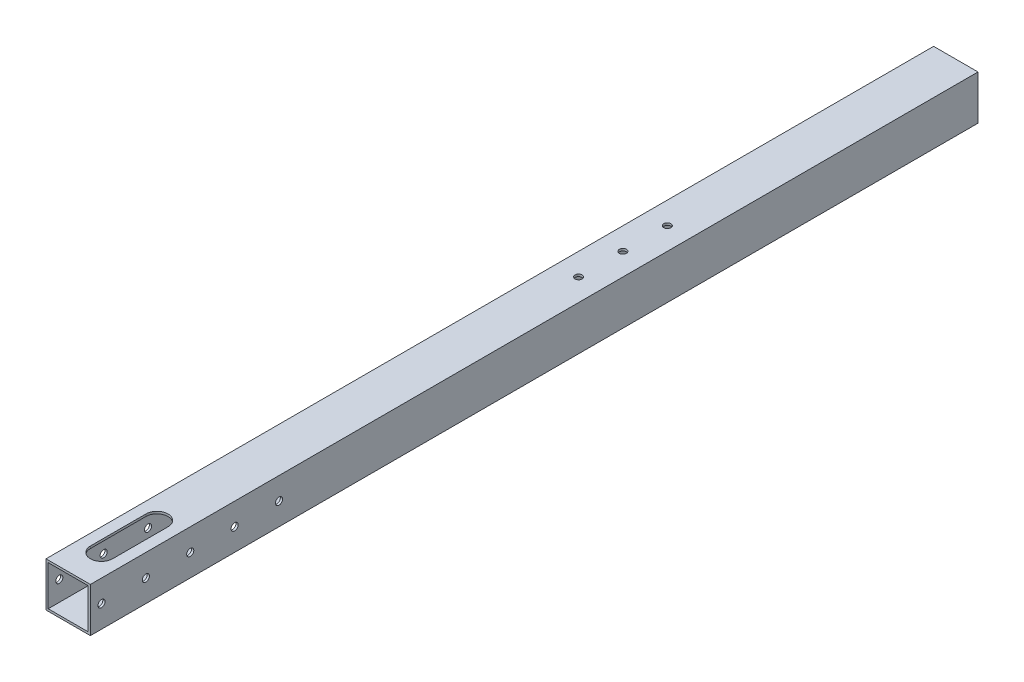
ISO-10303-21;
HEADER;
FILE_DESCRIPTION(('STEP AP214'),'2;1');
FILE_NAME('part.step','',(''),(''),'','','');
FILE_SCHEMA(('AUTOMOTIVE_DESIGN { 1 0 10303 214 1 1 1 1 }'));
ENDSEC;
DATA;
#1=APPLICATION_CONTEXT('core data for automotive mechanical design processes');
#2=APPLICATION_PROTOCOL_DEFINITION('international standard','automotive_design',2000,#1);
#3=PRODUCT_CONTEXT('',#1,'mechanical');
#4=PRODUCT('Part','Part','',(#3));
#5=PRODUCT_RELATED_PRODUCT_CATEGORY('part','',(#4));
#6=PRODUCT_DEFINITION_FORMATION('','',#4);
#7=PRODUCT_DEFINITION_CONTEXT('part definition',#1,'design');
#8=PRODUCT_DEFINITION('design','',#6,#7);
#9=PRODUCT_DEFINITION_SHAPE('','',#8);
#10=(LENGTH_UNIT() NAMED_UNIT(*) SI_UNIT(.MILLI.,.METRE.));
#11=(NAMED_UNIT(*) PLANE_ANGLE_UNIT() SI_UNIT($,.RADIAN.));
#12=(NAMED_UNIT(*) SI_UNIT($,.STERADIAN.) SOLID_ANGLE_UNIT());
#13=UNCERTAINTY_MEASURE_WITH_UNIT(LENGTH_MEASURE(1.E-05),#10,'distance_accuracy_value','');
#14=(GEOMETRIC_REPRESENTATION_CONTEXT(3) GLOBAL_UNCERTAINTY_ASSIGNED_CONTEXT((#13)) GLOBAL_UNIT_ASSIGNED_CONTEXT((#10,
#11,#12)) REPRESENTATION_CONTEXT('',''));
#15=CARTESIAN_POINT('',(0.,0.,0.));
#16=DIRECTION('',(0.,0.,1.));
#17=DIRECTION('',(1.,0.,0.));
#18=AXIS2_PLACEMENT_3D('',#15,#16,#17);
#19=CARTESIAN_POINT('',(0.,0.,400.));
#20=DIRECTION('',(0.,0.,1.));
#21=DIRECTION('',(1.,0.,0.));
#22=AXIS2_PLACEMENT_3D('',#19,#20,#21);
#23=PLANE('',#22);
#24=DIRECTION('',(0.,-1.,0.));
#25=VECTOR('',#24,1.);
#26=CARTESIAN_POINT('',(0.,0.,400.));
#27=LINE('',#26,#25);
#28=CARTESIAN_POINT('',(0.,0.,400.));
#29=VERTEX_POINT('',#28);
#30=CARTESIAN_POINT('',(0.,-20.,400.));
#31=VERTEX_POINT('',#30);
#32=EDGE_CURVE('E331',#29,#31,#27,.T.);
#33=ORIENTED_EDGE('',*,*,#32,.T.);
#34=DIRECTION('',(1.,0.,0.));
#35=VECTOR('',#34,1.);
#36=CARTESIAN_POINT('',(0.,-20.,400.));
#37=LINE('',#36,#35);
#38=CARTESIAN_POINT('',(20.,-20.,400.));
#39=VERTEX_POINT('',#38);
#40=EDGE_CURVE('E334',#31,#39,#37,.T.);
#41=ORIENTED_EDGE('',*,*,#40,.T.);
#42=DIRECTION('',(0.,1.,0.));
#43=VECTOR('',#42,1.);
#44=CARTESIAN_POINT('',(20.,0.,400.));
#45=LINE('',#44,#43);
#46=CARTESIAN_POINT('',(20.,0.,400.));
#47=VERTEX_POINT('',#46);
#48=EDGE_CURVE('E337',#39,#47,#45,.T.);
#49=ORIENTED_EDGE('',*,*,#48,.T.);
#50=DIRECTION('',(-1.,0.,0.));
#51=VECTOR('',#50,1.);
#52=CARTESIAN_POINT('',(0.,0.,400.));
#53=LINE('',#52,#51);
#54=EDGE_CURVE('E339',#47,#29,#53,.T.);
#55=ORIENTED_EDGE('',*,*,#54,.T.);
#56=EDGE_LOOP('',(#33,#41,#49,#55));
#57=FACE_BOUND('',#56,.T.);
#58=DIRECTION('',(1.,0.,0.));
#59=VECTOR('',#58,1.);
#60=CARTESIAN_POINT('',(0.,-19.,400.));
#61=LINE('',#60,#59);
#62=CARTESIAN_POINT('',(1.,-19.,400.));
#63=VERTEX_POINT('',#62);
#64=CARTESIAN_POINT('',(19.,-19.,400.));
#65=VERTEX_POINT('',#64);
#66=EDGE_CURVE('E302',#63,#65,#61,.T.);
#67=ORIENTED_EDGE('',*,*,#66,.F.);
#68=DIRECTION('',(0.,-1.,0.));
#69=VECTOR('',#68,1.);
#70=CARTESIAN_POINT('',(1.,0.,400.));
#71=LINE('',#70,#69);
#72=CARTESIAN_POINT('',(1.,-1.,400.));
#73=VERTEX_POINT('',#72);
#74=EDGE_CURVE('E300',#73,#63,#71,.T.);
#75=ORIENTED_EDGE('',*,*,#74,.F.);
#76=DIRECTION('',(-1.,0.,0.));
#77=VECTOR('',#76,1.);
#78=CARTESIAN_POINT('',(0.,-1.,400.));
#79=LINE('',#78,#77);
#80=CARTESIAN_POINT('',(19.,-1.,400.));
#81=VERTEX_POINT('',#80);
#82=EDGE_CURVE('E308',#81,#73,#79,.T.);
#83=ORIENTED_EDGE('',*,*,#82,.F.);
#84=DIRECTION('',(0.,1.,0.));
#85=VECTOR('',#84,1.);
#86=CARTESIAN_POINT('',(19.,0.,400.));
#87=LINE('',#86,#85);
#88=EDGE_CURVE('E305',#65,#81,#87,.T.);
#89=ORIENTED_EDGE('',*,*,#88,.F.);
#90=EDGE_LOOP('',(#67,#75,#83,#89));
#91=FACE_BOUND('',#90,.T.);
#92=ADVANCED_FACE('F65',(#57,#91),#23,.T.);
#93=CARTESIAN_POINT('',(0.,0.,0.));
#94=DIRECTION('',(0.,0.,1.));
#95=DIRECTION('',(1.,0.,0.));
#96=AXIS2_PLACEMENT_3D('',#93,#94,#95);
#97=PLANE('',#96);
#98=DIRECTION('',(0.,-1.,0.));
#99=VECTOR('',#98,1.);
#100=CARTESIAN_POINT('',(0.,0.,0.));
#101=LINE('',#100,#99);
#102=CARTESIAN_POINT('',(0.,0.,0.));
#103=VERTEX_POINT('',#102);
#104=CARTESIAN_POINT('',(0.,-20.,0.));
#105=VERTEX_POINT('',#104);
#106=EDGE_CURVE('E330',#103,#105,#101,.T.);
#107=ORIENTED_EDGE('',*,*,#106,.F.);
#108=DIRECTION('',(-1.,0.,0.));
#109=VECTOR('',#108,1.);
#110=CARTESIAN_POINT('',(0.,0.,0.));
#111=LINE('',#110,#109);
#112=CARTESIAN_POINT('',(20.,0.,0.));
#113=VERTEX_POINT('',#112);
#114=EDGE_CURVE('E335',#113,#103,#111,.T.);
#115=ORIENTED_EDGE('',*,*,#114,.F.);
#116=DIRECTION('',(0.,1.,0.));
#117=VECTOR('',#116,1.);
#118=CARTESIAN_POINT('',(20.,0.,0.));
#119=LINE('',#118,#117);
#120=CARTESIAN_POINT('',(20.,-20.,0.));
#121=VERTEX_POINT('',#120);
#122=EDGE_CURVE('E346',#121,#113,#119,.T.);
#123=ORIENTED_EDGE('',*,*,#122,.F.);
#124=DIRECTION('',(1.,0.,0.));
#125=VECTOR('',#124,1.);
#126=CARTESIAN_POINT('',(0.,-20.,0.));
#127=LINE('',#126,#125);
#128=EDGE_CURVE('E344',#105,#121,#127,.T.);
#129=ORIENTED_EDGE('',*,*,#128,.F.);
#130=EDGE_LOOP('',(#107,#115,#123,#129));
#131=FACE_BOUND('',#130,.T.);
#132=DIRECTION('',(0.,-1.,0.));
#133=VECTOR('',#132,1.);
#134=CARTESIAN_POINT('',(1.,0.,0.));
#135=LINE('',#134,#133);
#136=CARTESIAN_POINT('',(1.,-1.,0.));
#137=VERTEX_POINT('',#136);
#138=CARTESIAN_POINT('',(1.,-19.,0.));
#139=VERTEX_POINT('',#138);
#140=EDGE_CURVE('E299',#137,#139,#135,.T.);
#141=ORIENTED_EDGE('',*,*,#140,.T.);
#142=DIRECTION('',(1.,0.,0.));
#143=VECTOR('',#142,1.);
#144=CARTESIAN_POINT('',(0.,-19.,0.));
#145=LINE('',#144,#143);
#146=CARTESIAN_POINT('',(19.,-19.,0.));
#147=VERTEX_POINT('',#146);
#148=EDGE_CURVE('E313',#139,#147,#145,.T.);
#149=ORIENTED_EDGE('',*,*,#148,.T.);
#150=DIRECTION('',(0.,1.,0.));
#151=VECTOR('',#150,1.);
#152=CARTESIAN_POINT('',(19.,0.,0.));
#153=LINE('',#152,#151);
#154=CARTESIAN_POINT('',(19.,-1.,0.));
#155=VERTEX_POINT('',#154);
#156=EDGE_CURVE('E316',#147,#155,#153,.T.);
#157=ORIENTED_EDGE('',*,*,#156,.T.);
#158=DIRECTION('',(-1.,0.,0.));
#159=VECTOR('',#158,1.);
#160=CARTESIAN_POINT('',(0.,-1.,0.));
#161=LINE('',#160,#159);
#162=EDGE_CURVE('E303',#155,#137,#161,.T.);
#163=ORIENTED_EDGE('',*,*,#162,.T.);
#164=EDGE_LOOP('',(#141,#149,#157,#163));
#165=FACE_BOUND('',#164,.T.);
#166=ADVANCED_FACE('F407',(#131,#165),#97,.F.);
#167=CARTESIAN_POINT('',(0.,0.,400.));
#168=DIRECTION('',(1.,0.,0.));
#169=DIRECTION('',(0.,1.,0.));
#170=AXIS2_PLACEMENT_3D('',#167,#168,#169);
#171=PLANE('',#170);
#172=CARTESIAN_POINT('',(0.,-9.99999999999993,395.));
#173=DIRECTION('',(1.,0.,0.));
#174=DIRECTION('',(0.,1.,0.));
#175=AXIS2_PLACEMENT_3D('',#172,#173,#174);
#176=CIRCLE('',#175,1.59999999999996);
#177=CARTESIAN_POINT('',(0.,-8.39999999999996,395.));
#178=VERTEX_POINT('',#177);
#179=EDGE_CURVE('E250',#178,#178,#176,.T.);
#180=ORIENTED_EDGE('',*,*,#179,.T.);
#181=EDGE_LOOP('',(#180));
#182=FACE_BOUND('',#181,.T.);
#183=CARTESIAN_POINT('',(0.,-9.99999999999993,375.));
#184=DIRECTION('',(1.,0.,0.));
#185=DIRECTION('',(0.,1.,0.));
#186=AXIS2_PLACEMENT_3D('',#183,#184,#185);
#187=CIRCLE('',#186,1.59999999999996);
#188=CARTESIAN_POINT('',(0.,-8.39999999999996,375.));
#189=VERTEX_POINT('',#188);
#190=EDGE_CURVE('E260',#189,#189,#187,.T.);
#191=ORIENTED_EDGE('',*,*,#190,.T.);
#192=EDGE_LOOP('',(#191));
#193=FACE_BOUND('',#192,.T.);
#194=CARTESIAN_POINT('',(0.,-9.99999999999993,355.));
#195=DIRECTION('',(1.,0.,0.));
#196=DIRECTION('',(0.,1.,0.));
#197=AXIS2_PLACEMENT_3D('',#194,#195,#196);
#198=CIRCLE('',#197,1.59999999999996);
#199=CARTESIAN_POINT('',(0.,-8.39999999999996,355.));
#200=VERTEX_POINT('',#199);
#201=EDGE_CURVE('E266',#200,#200,#198,.T.);
#202=ORIENTED_EDGE('',*,*,#201,.T.);
#203=EDGE_LOOP('',(#202));
#204=FACE_BOUND('',#203,.T.);
#205=CARTESIAN_POINT('',(0.,-9.99999999999993,335.));
#206=DIRECTION('',(1.,0.,0.));
#207=DIRECTION('',(0.,1.,0.));
#208=AXIS2_PLACEMENT_3D('',#205,#206,#207);
#209=CIRCLE('',#208,1.59999999999996);
#210=CARTESIAN_POINT('',(0.,-8.39999999999996,335.));
#211=VERTEX_POINT('',#210);
#212=EDGE_CURVE('E272',#211,#211,#209,.T.);
#213=ORIENTED_EDGE('',*,*,#212,.T.);
#214=EDGE_LOOP('',(#213));
#215=FACE_BOUND('',#214,.T.);
#216=CARTESIAN_POINT('',(0.,-9.99999999999993,315.));
#217=DIRECTION('',(1.,0.,0.));
#218=DIRECTION('',(0.,1.,0.));
#219=AXIS2_PLACEMENT_3D('',#216,#217,#218);
#220=CIRCLE('',#219,1.59999999999996);
#221=CARTESIAN_POINT('',(0.,-8.39999999999996,315.));
#222=VERTEX_POINT('',#221);
#223=EDGE_CURVE('E249',#222,#222,#220,.T.);
#224=ORIENTED_EDGE('',*,*,#223,.T.);
#225=EDGE_LOOP('',(#224));
#226=FACE_BOUND('',#225,.T.);
#227=ORIENTED_EDGE('',*,*,#106,.T.);
#228=DIRECTION('',(0.,0.,-1.));
#229=VECTOR('',#228,1.);
#230=CARTESIAN_POINT('',(0.,-20.,400.));
#231=LINE('',#230,#229);
#232=EDGE_CURVE('E12',#31,#105,#231,.T.);
#233=ORIENTED_EDGE('',*,*,#232,.F.);
#234=ORIENTED_EDGE('',*,*,#32,.F.);
#235=DIRECTION('',(0.,0.,-1.));
#236=VECTOR('',#235,1.);
#237=CARTESIAN_POINT('',(0.,0.,400.));
#238=LINE('',#237,#236);
#239=EDGE_CURVE('E341',#29,#103,#238,.T.);
#240=ORIENTED_EDGE('',*,*,#239,.T.);
#241=EDGE_LOOP('',(#227,#233,#234,#240));
#242=FACE_BOUND('',#241,.T.);
#243=ADVANCED_FACE('F67',(#182,#193,#204,#215,#226,#242),#171,.F.);
#244=CARTESIAN_POINT('',(0.,-20.,400.));
#245=DIRECTION('',(0.,1.,0.));
#246=DIRECTION('',(0.,0.,1.));
#247=AXIS2_PLACEMENT_3D('',#244,#245,#246);
#248=PLANE('',#247);
#249=CARTESIAN_POINT('',(10.,-20.,130.));
#250=DIRECTION('',(0.,1.,0.));
#251=DIRECTION('',(0.,0.,1.));
#252=AXIS2_PLACEMENT_3D('',#249,#250,#251);
#253=CIRCLE('',#252,1.59999999999999);
#254=CARTESIAN_POINT('',(10.,-20.,131.6));
#255=VERTEX_POINT('',#254);
#256=EDGE_CURVE('E369',#255,#255,#253,.T.);
#257=ORIENTED_EDGE('',*,*,#256,.T.);
#258=EDGE_LOOP('',(#257));
#259=FACE_BOUND('',#258,.T.);
#260=CARTESIAN_POINT('',(10.,-20.,150.));
#261=DIRECTION('',(0.,1.,0.));
#262=DIRECTION('',(0.,0.,1.));
#263=AXIS2_PLACEMENT_3D('',#260,#261,#262);
#264=CIRCLE('',#263,1.59999999999999);
#265=CARTESIAN_POINT('',(10.,-20.,151.6));
#266=VERTEX_POINT('',#265);
#267=EDGE_CURVE('E458',#266,#266,#264,.T.);
#268=ORIENTED_EDGE('',*,*,#267,.T.);
#269=EDGE_LOOP('',(#268));
#270=FACE_BOUND('',#269,.T.);
#271=CARTESIAN_POINT('',(10.,-20.,170.));
#272=DIRECTION('',(0.,1.,0.));
#273=DIRECTION('',(0.,0.,1.));
#274=AXIS2_PLACEMENT_3D('',#271,#272,#273);
#275=CIRCLE('',#274,1.59999999999999);
#276=CARTESIAN_POINT('',(10.,-20.,171.6));
#277=VERTEX_POINT('',#276);
#278=EDGE_CURVE('E382',#277,#277,#275,.T.);
#279=ORIENTED_EDGE('',*,*,#278,.T.);
#280=EDGE_LOOP('',(#279));
#281=FACE_BOUND('',#280,.T.);
#282=DIRECTION('',(0.,0.,-1.));
#283=VECTOR('',#282,1.);
#284=CARTESIAN_POINT('',(5.,-20.,335.));
#285=LINE('',#284,#283);
#286=CARTESIAN_POINT('',(5.,-20.,335.));
#287=VERTEX_POINT('',#286);
#288=CARTESIAN_POINT('',(5.00000000000001,-20.,315.));
#289=VERTEX_POINT('',#288);
#290=EDGE_CURVE('E203',#287,#289,#285,.T.);
#291=ORIENTED_EDGE('',*,*,#290,.F.);
#292=CARTESIAN_POINT('',(10.,-20.,335.));
#293=DIRECTION('',(0.,-1.,0.));
#294=DIRECTION('',(0.,0.,-1.));
#295=AXIS2_PLACEMENT_3D('',#292,#293,#294);
#296=CIRCLE('',#295,5.);
#297=CARTESIAN_POINT('',(15.,-20.,335.));
#298=VERTEX_POINT('',#297);
#299=EDGE_CURVE('E82',#298,#287,#296,.T.);
#300=ORIENTED_EDGE('',*,*,#299,.F.);
#301=DIRECTION('',(0.,0.,1.));
#302=VECTOR('',#301,1.);
#303=CARTESIAN_POINT('',(15.,-20.,335.));
#304=LINE('',#303,#302);
#305=CARTESIAN_POINT('',(15.,-20.,315.));
#306=VERTEX_POINT('',#305);
#307=EDGE_CURVE('E190',#306,#298,#304,.T.);
#308=ORIENTED_EDGE('',*,*,#307,.F.);
#309=CARTESIAN_POINT('',(10.,-20.,315.));
#310=DIRECTION('',(0.,-1.,0.));
#311=DIRECTION('',(0.,0.,-1.));
#312=AXIS2_PLACEMENT_3D('',#309,#310,#311);
#313=CIRCLE('',#312,5.);
#314=EDGE_CURVE('E198',#289,#306,#313,.T.);
#315=ORIENTED_EDGE('',*,*,#314,.F.);
#316=EDGE_LOOP('',(#291,#300,#308,#315));
#317=FACE_BOUND('',#316,.T.);
#318=ORIENTED_EDGE('',*,*,#128,.T.);
#319=DIRECTION('',(0.,0.,-1.));
#320=VECTOR('',#319,1.);
#321=CARTESIAN_POINT('',(20.,-20.,400.));
#322=LINE('',#321,#320);
#323=EDGE_CURVE('E74',#39,#121,#322,.T.);
#324=ORIENTED_EDGE('',*,*,#323,.F.);
#325=ORIENTED_EDGE('',*,*,#40,.F.);
#326=ORIENTED_EDGE('',*,*,#232,.T.);
#327=EDGE_LOOP('',(#318,#324,#325,#326));
#328=FACE_BOUND('',#327,.T.);
#329=ADVANCED_FACE('F201',(#259,#270,#281,#317,#328),#248,.F.);
#330=CARTESIAN_POINT('',(20.,0.,400.));
#331=DIRECTION('',(-1.,0.,0.));
#332=DIRECTION('',(0.,-1.,0.));
#333=AXIS2_PLACEMENT_3D('',#330,#331,#332);
#334=PLANE('',#333);
#335=CARTESIAN_POINT('',(20.,-9.99999999999993,395.));
#336=DIRECTION('',(1.,0.,0.));
#337=DIRECTION('',(0.,1.,0.));
#338=AXIS2_PLACEMENT_3D('',#335,#336,#337);
#339=CIRCLE('',#338,1.59999999999996);
#340=CARTESIAN_POINT('',(20.,-8.39999999999996,395.));
#341=VERTEX_POINT('',#340);
#342=EDGE_CURVE('E254',#341,#341,#339,.T.);
#343=ORIENTED_EDGE('',*,*,#342,.F.);
#344=EDGE_LOOP('',(#343));
#345=FACE_BOUND('',#344,.T.);
#346=CARTESIAN_POINT('',(20.,-9.99999999999993,375.));
#347=DIRECTION('',(1.,0.,0.));
#348=DIRECTION('',(0.,1.,0.));
#349=AXIS2_PLACEMENT_3D('',#346,#347,#348);
#350=CIRCLE('',#349,1.59999999999996);
#351=CARTESIAN_POINT('',(20.,-8.39999999999996,375.));
#352=VERTEX_POINT('',#351);
#353=EDGE_CURVE('E257',#352,#352,#350,.T.);
#354=ORIENTED_EDGE('',*,*,#353,.F.);
#355=EDGE_LOOP('',(#354));
#356=FACE_BOUND('',#355,.T.);
#357=CARTESIAN_POINT('',(20.,-9.99999999999993,355.));
#358=DIRECTION('',(1.,0.,0.));
#359=DIRECTION('',(0.,1.,0.));
#360=AXIS2_PLACEMENT_3D('',#357,#358,#359);
#361=CIRCLE('',#360,1.59999999999996);
#362=CARTESIAN_POINT('',(20.,-8.39999999999996,355.));
#363=VERTEX_POINT('',#362);
#364=EDGE_CURVE('E263',#363,#363,#361,.T.);
#365=ORIENTED_EDGE('',*,*,#364,.F.);
#366=EDGE_LOOP('',(#365));
#367=FACE_BOUND('',#366,.T.);
#368=CARTESIAN_POINT('',(20.,-9.99999999999993,335.));
#369=DIRECTION('',(1.,0.,0.));
#370=DIRECTION('',(0.,1.,0.));
#371=AXIS2_PLACEMENT_3D('',#368,#369,#370);
#372=CIRCLE('',#371,1.59999999999996);
#373=CARTESIAN_POINT('',(20.,-8.39999999999996,335.));
#374=VERTEX_POINT('',#373);
#375=EDGE_CURVE('E269',#374,#374,#372,.T.);
#376=ORIENTED_EDGE('',*,*,#375,.F.);
#377=EDGE_LOOP('',(#376));
#378=FACE_BOUND('',#377,.T.);
#379=CARTESIAN_POINT('',(20.,-9.99999999999993,315.));
#380=DIRECTION('',(1.,0.,0.));
#381=DIRECTION('',(0.,1.,0.));
#382=AXIS2_PLACEMENT_3D('',#379,#380,#381);
#383=CIRCLE('',#382,1.59999999999996);
#384=CARTESIAN_POINT('',(20.,-8.39999999999996,315.));
#385=VERTEX_POINT('',#384);
#386=EDGE_CURVE('E275',#385,#385,#383,.T.);
#387=ORIENTED_EDGE('',*,*,#386,.F.);
#388=EDGE_LOOP('',(#387));
#389=FACE_BOUND('',#388,.T.);
#390=ORIENTED_EDGE('',*,*,#122,.T.);
#391=DIRECTION('',(0.,0.,-1.));
#392=VECTOR('',#391,1.);
#393=CARTESIAN_POINT('',(20.,0.,400.));
#394=LINE('',#393,#392);
#395=EDGE_CURVE('E351',#47,#113,#394,.T.);
#396=ORIENTED_EDGE('',*,*,#395,.F.);
#397=ORIENTED_EDGE('',*,*,#48,.F.);
#398=ORIENTED_EDGE('',*,*,#323,.T.);
#399=EDGE_LOOP('',(#390,#396,#397,#398));
#400=FACE_BOUND('',#399,.T.);
#401=ADVANCED_FACE('F441',(#345,#356,#367,#378,#389,#400),#334,.F.);
#402=CARTESIAN_POINT('',(0.,0.,400.));
#403=DIRECTION('',(0.,-1.,0.));
#404=DIRECTION('',(0.,0.,-1.));
#405=AXIS2_PLACEMENT_3D('',#402,#403,#404);
#406=PLANE('',#405);
#407=CARTESIAN_POINT('',(10.,0.,130.));
#408=DIRECTION('',(0.,1.,0.));
#409=DIRECTION('',(0.,0.,1.));
#410=AXIS2_PLACEMENT_3D('',#407,#408,#409);
#411=CIRCLE('',#410,1.59999999999999);
#412=CARTESIAN_POINT('',(10.,0.,131.6));
#413=VERTEX_POINT('',#412);
#414=EDGE_CURVE('E471',#413,#413,#411,.T.);
#415=ORIENTED_EDGE('',*,*,#414,.F.);
#416=EDGE_LOOP('',(#415));
#417=FACE_BOUND('',#416,.T.);
#418=CARTESIAN_POINT('',(10.,0.,150.));
#419=DIRECTION('',(0.,1.,0.));
#420=DIRECTION('',(0.,0.,1.));
#421=AXIS2_PLACEMENT_3D('',#418,#419,#420);
#422=CIRCLE('',#421,1.59999999999999);
#423=CARTESIAN_POINT('',(10.,0.,151.6));
#424=VERTEX_POINT('',#423);
#425=EDGE_CURVE('E466',#424,#424,#422,.T.);
#426=ORIENTED_EDGE('',*,*,#425,.F.);
#427=EDGE_LOOP('',(#426));
#428=FACE_BOUND('',#427,.T.);
#429=CARTESIAN_POINT('',(10.,0.,170.));
#430=DIRECTION('',(0.,1.,0.));
#431=DIRECTION('',(0.,0.,1.));
#432=AXIS2_PLACEMENT_3D('',#429,#430,#431);
#433=CIRCLE('',#432,1.59999999999999);
#434=CARTESIAN_POINT('',(10.,0.,171.6));
#435=VERTEX_POINT('',#434);
#436=EDGE_CURVE('E462',#435,#435,#433,.T.);
#437=ORIENTED_EDGE('',*,*,#436,.F.);
#438=EDGE_LOOP('',(#437));
#439=FACE_BOUND('',#438,.T.);
#440=CARTESIAN_POINT('',(10.,0.,385.));
#441=DIRECTION('',(0.,1.,0.));
#442=DIRECTION('',(0.,0.,1.));
#443=AXIS2_PLACEMENT_3D('',#440,#441,#442);
#444=CIRCLE('',#443,5.);
#445=CARTESIAN_POINT('',(5.,0.,385.));
#446=VERTEX_POINT('',#445);
#447=CARTESIAN_POINT('',(15.,0.,385.));
#448=VERTEX_POINT('',#447);
#449=EDGE_CURVE('E232',#446,#448,#444,.T.);
#450=ORIENTED_EDGE('',*,*,#449,.F.);
#451=DIRECTION('',(0.,0.,1.));
#452=VECTOR('',#451,1.);
#453=CARTESIAN_POINT('',(5.,0.,360.));
#454=LINE('',#453,#452);
#455=CARTESIAN_POINT('',(5.,0.,360.));
#456=VERTEX_POINT('',#455);
#457=EDGE_CURVE('E229',#456,#446,#454,.T.);
#458=ORIENTED_EDGE('',*,*,#457,.F.);
#459=CARTESIAN_POINT('',(10.,0.,360.));
#460=DIRECTION('',(0.,1.,0.));
#461=DIRECTION('',(0.,0.,1.));
#462=AXIS2_PLACEMENT_3D('',#459,#460,#461);
#463=CIRCLE('',#462,5.);
#464=CARTESIAN_POINT('',(15.,0.,360.));
#465=VERTEX_POINT('',#464);
#466=EDGE_CURVE('E226',#465,#456,#463,.T.);
#467=ORIENTED_EDGE('',*,*,#466,.F.);
#468=DIRECTION('',(0.,0.,-1.));
#469=VECTOR('',#468,1.);
#470=CARTESIAN_POINT('',(15.,0.,360.));
#471=LINE('',#470,#469);
#472=EDGE_CURVE('E235',#448,#465,#471,.T.);
#473=ORIENTED_EDGE('',*,*,#472,.F.);
#474=EDGE_LOOP('',(#450,#458,#467,#473));
#475=FACE_BOUND('',#474,.T.);
#476=ORIENTED_EDGE('',*,*,#114,.T.);
#477=ORIENTED_EDGE('',*,*,#239,.F.);
#478=ORIENTED_EDGE('',*,*,#54,.F.);
#479=ORIENTED_EDGE('',*,*,#395,.T.);
#480=EDGE_LOOP('',(#476,#477,#478,#479));
#481=FACE_BOUND('',#480,.T.);
#482=ADVANCED_FACE('F438',(#417,#428,#439,#475,#481),#406,.F.);
#483=CARTESIAN_POINT('',(1.,0.,400.));
#484=DIRECTION('',(1.,0.,0.));
#485=DIRECTION('',(0.,1.,0.));
#486=AXIS2_PLACEMENT_3D('',#483,#484,#485);
#487=PLANE('',#486);
#488=CARTESIAN_POINT('',(1.,-9.99999999999993,395.));
#489=DIRECTION('',(1.,0.,0.));
#490=DIRECTION('',(0.,1.,0.));
#491=AXIS2_PLACEMENT_3D('',#488,#489,#490);
#492=CIRCLE('',#491,1.59999999999996);
#493=CARTESIAN_POINT('',(1.,-8.39999999999996,395.));
#494=VERTEX_POINT('',#493);
#495=EDGE_CURVE('E296',#494,#494,#492,.T.);
#496=ORIENTED_EDGE('',*,*,#495,.F.);
#497=EDGE_LOOP('',(#496));
#498=FACE_BOUND('',#497,.T.);
#499=CARTESIAN_POINT('',(1.,-9.99999999999993,375.));
#500=DIRECTION('',(1.,0.,0.));
#501=DIRECTION('',(0.,1.,0.));
#502=AXIS2_PLACEMENT_3D('',#499,#500,#501);
#503=CIRCLE('',#502,1.59999999999996);
#504=CARTESIAN_POINT('',(1.,-8.39999999999996,375.));
#505=VERTEX_POINT('',#504);
#506=EDGE_CURVE('E292',#505,#505,#503,.T.);
#507=ORIENTED_EDGE('',*,*,#506,.F.);
#508=EDGE_LOOP('',(#507));
#509=FACE_BOUND('',#508,.T.);
#510=CARTESIAN_POINT('',(1.,-9.99999999999993,355.));
#511=DIRECTION('',(1.,0.,0.));
#512=DIRECTION('',(0.,1.,0.));
#513=AXIS2_PLACEMENT_3D('',#510,#511,#512);
#514=CIRCLE('',#513,1.59999999999996);
#515=CARTESIAN_POINT('',(1.,-8.39999999999996,355.));
#516=VERTEX_POINT('',#515);
#517=EDGE_CURVE('E288',#516,#516,#514,.T.);
#518=ORIENTED_EDGE('',*,*,#517,.F.);
#519=EDGE_LOOP('',(#518));
#520=FACE_BOUND('',#519,.T.);
#521=CARTESIAN_POINT('',(1.,-9.99999999999993,335.));
#522=DIRECTION('',(1.,0.,0.));
#523=DIRECTION('',(0.,1.,0.));
#524=AXIS2_PLACEMENT_3D('',#521,#522,#523);
#525=CIRCLE('',#524,1.59999999999996);
#526=CARTESIAN_POINT('',(1.,-8.39999999999996,335.));
#527=VERTEX_POINT('',#526);
#528=EDGE_CURVE('E284',#527,#527,#525,.T.);
#529=ORIENTED_EDGE('',*,*,#528,.F.);
#530=EDGE_LOOP('',(#529));
#531=FACE_BOUND('',#530,.T.);
#532=CARTESIAN_POINT('',(1.,-9.99999999999993,315.));
#533=DIRECTION('',(1.,0.,0.));
#534=DIRECTION('',(0.,1.,0.));
#535=AXIS2_PLACEMENT_3D('',#532,#533,#534);
#536=CIRCLE('',#535,1.59999999999996);
#537=CARTESIAN_POINT('',(1.,-8.39999999999996,315.));
#538=VERTEX_POINT('',#537);
#539=EDGE_CURVE('E280',#538,#538,#536,.T.);
#540=ORIENTED_EDGE('',*,*,#539,.F.);
#541=EDGE_LOOP('',(#540));
#542=FACE_BOUND('',#541,.T.);
#543=ORIENTED_EDGE('',*,*,#140,.F.);
#544=DIRECTION('',(0.,0.,-1.));
#545=VECTOR('',#544,1.);
#546=CARTESIAN_POINT('',(1.,-1.,400.));
#547=LINE('',#546,#545);
#548=EDGE_CURVE('E310',#73,#137,#547,.T.);
#549=ORIENTED_EDGE('',*,*,#548,.F.);
#550=ORIENTED_EDGE('',*,*,#74,.T.);
#551=DIRECTION('',(0.,0.,-1.));
#552=VECTOR('',#551,1.);
#553=CARTESIAN_POINT('',(1.,-19.,400.));
#554=LINE('',#553,#552);
#555=EDGE_CURVE('E327',#63,#139,#554,.T.);
#556=ORIENTED_EDGE('',*,*,#555,.T.);
#557=EDGE_LOOP('',(#543,#549,#550,#556));
#558=FACE_BOUND('',#557,.T.);
#559=ADVANCED_FACE('F396',(#498,#509,#520,#531,#542,#558),#487,.T.);
#560=CARTESIAN_POINT('',(0.,-19.,400.));
#561=DIRECTION('',(0.,1.,0.));
#562=DIRECTION('',(0.,0.,1.));
#563=AXIS2_PLACEMENT_3D('',#560,#561,#562);
#564=PLANE('',#563);
#565=CARTESIAN_POINT('',(10.,-19.,130.));
#566=DIRECTION('',(0.,1.,0.));
#567=DIRECTION('',(0.,0.,1.));
#568=AXIS2_PLACEMENT_3D('',#565,#566,#567);
#569=CIRCLE('',#568,1.59999999999999);
#570=CARTESIAN_POINT('',(10.,-19.,131.6));
#571=VERTEX_POINT('',#570);
#572=EDGE_CURVE('E212',#571,#571,#569,.T.);
#573=ORIENTED_EDGE('',*,*,#572,.F.);
#574=EDGE_LOOP('',(#573));
#575=FACE_BOUND('',#574,.T.);
#576=CARTESIAN_POINT('',(10.,-19.,150.));
#577=DIRECTION('',(0.,1.,0.));
#578=DIRECTION('',(0.,0.,1.));
#579=AXIS2_PLACEMENT_3D('',#576,#577,#578);
#580=CIRCLE('',#579,1.59999999999999);
#581=CARTESIAN_POINT('',(10.,-19.,151.6));
#582=VERTEX_POINT('',#581);
#583=EDGE_CURVE('E372',#582,#582,#580,.T.);
#584=ORIENTED_EDGE('',*,*,#583,.F.);
#585=EDGE_LOOP('',(#584));
#586=FACE_BOUND('',#585,.T.);
#587=CARTESIAN_POINT('',(10.,-19.,170.));
#588=DIRECTION('',(0.,1.,0.));
#589=DIRECTION('',(0.,0.,1.));
#590=AXIS2_PLACEMENT_3D('',#587,#588,#589);
#591=CIRCLE('',#590,1.59999999999999);
#592=CARTESIAN_POINT('',(10.,-19.,171.6));
#593=VERTEX_POINT('',#592);
#594=EDGE_CURVE('E368',#593,#593,#591,.T.);
#595=ORIENTED_EDGE('',*,*,#594,.F.);
#596=EDGE_LOOP('',(#595));
#597=FACE_BOUND('',#596,.T.);
#598=CARTESIAN_POINT('',(10.,-19.,335.));
#599=DIRECTION('',(0.,1.,0.));
#600=DIRECTION('',(0.,0.,1.));
#601=AXIS2_PLACEMENT_3D('',#598,#599,#600);
#602=CIRCLE('',#601,5.);
#603=CARTESIAN_POINT('',(15.,-19.,335.));
#604=VERTEX_POINT('',#603);
#605=CARTESIAN_POINT('',(5.,-19.,335.));
#606=VERTEX_POINT('',#605);
#607=EDGE_CURVE('E183',#604,#606,#602,.F.);
#608=ORIENTED_EDGE('',*,*,#607,.T.);
#609=DIRECTION('',(0.,0.,-1.));
#610=VECTOR('',#609,1.);
#611=CARTESIAN_POINT('',(5.,-19.,335.));
#612=LINE('',#611,#610);
#613=CARTESIAN_POINT('',(5.00000000000001,-19.,315.));
#614=VERTEX_POINT('',#613);
#615=EDGE_CURVE('E206',#606,#614,#612,.T.);
#616=ORIENTED_EDGE('',*,*,#615,.T.);
#617=CARTESIAN_POINT('',(10.,-19.,315.));
#618=DIRECTION('',(0.,1.,0.));
#619=DIRECTION('',(0.,0.,1.));
#620=AXIS2_PLACEMENT_3D('',#617,#618,#619);
#621=CIRCLE('',#620,5.);
#622=CARTESIAN_POINT('',(15.,-19.,315.));
#623=VERTEX_POINT('',#622);
#624=EDGE_CURVE('E186',#614,#623,#621,.F.);
#625=ORIENTED_EDGE('',*,*,#624,.T.);
#626=DIRECTION('',(0.,0.,1.));
#627=VECTOR('',#626,1.);
#628=CARTESIAN_POINT('',(15.,-19.,335.));
#629=LINE('',#628,#627);
#630=EDGE_CURVE('E187',#623,#604,#629,.T.);
#631=ORIENTED_EDGE('',*,*,#630,.T.);
#632=EDGE_LOOP('',(#608,#616,#625,#631));
#633=FACE_BOUND('',#632,.T.);
#634=ORIENTED_EDGE('',*,*,#148,.F.);
#635=ORIENTED_EDGE('',*,*,#555,.F.);
#636=ORIENTED_EDGE('',*,*,#66,.T.);
#637=DIRECTION('',(0.,0.,-1.));
#638=VECTOR('',#637,1.);
#639=CARTESIAN_POINT('',(19.,-19.,400.));
#640=LINE('',#639,#638);
#641=EDGE_CURVE('E325',#65,#147,#640,.T.);
#642=ORIENTED_EDGE('',*,*,#641,.T.);
#643=EDGE_LOOP('',(#634,#635,#636,#642));
#644=FACE_BOUND('',#643,.T.);
#645=ADVANCED_FACE('F392',(#575,#586,#597,#633,#644),#564,.T.);
#646=CARTESIAN_POINT('',(19.,0.,400.));
#647=DIRECTION('',(-1.,0.,0.));
#648=DIRECTION('',(0.,-1.,0.));
#649=AXIS2_PLACEMENT_3D('',#646,#647,#648);
#650=PLANE('',#649);
#651=CARTESIAN_POINT('',(19.,-9.99999999999993,395.));
#652=DIRECTION('',(-1.,0.,0.));
#653=DIRECTION('',(0.,-1.,0.));
#654=AXIS2_PLACEMENT_3D('',#651,#652,#653);
#655=CIRCLE('',#654,1.59999999999996);
#656=CARTESIAN_POINT('',(19.,-11.5999999999999,395.));
#657=VERTEX_POINT('',#656);
#658=EDGE_CURVE('E295',#657,#657,#655,.T.);
#659=ORIENTED_EDGE('',*,*,#658,.F.);
#660=EDGE_LOOP('',(#659));
#661=FACE_BOUND('',#660,.T.);
#662=CARTESIAN_POINT('',(19.,-9.99999999999993,375.));
#663=DIRECTION('',(-1.,0.,0.));
#664=DIRECTION('',(0.,-1.,0.));
#665=AXIS2_PLACEMENT_3D('',#662,#663,#664);
#666=CIRCLE('',#665,1.59999999999996);
#667=CARTESIAN_POINT('',(19.,-11.5999999999999,375.));
#668=VERTEX_POINT('',#667);
#669=EDGE_CURVE('E291',#668,#668,#666,.T.);
#670=ORIENTED_EDGE('',*,*,#669,.F.);
#671=EDGE_LOOP('',(#670));
#672=FACE_BOUND('',#671,.T.);
#673=CARTESIAN_POINT('',(19.,-9.99999999999993,355.));
#674=DIRECTION('',(-1.,0.,0.));
#675=DIRECTION('',(0.,-1.,0.));
#676=AXIS2_PLACEMENT_3D('',#673,#674,#675);
#677=CIRCLE('',#676,1.59999999999996);
#678=CARTESIAN_POINT('',(19.,-11.5999999999999,355.));
#679=VERTEX_POINT('',#678);
#680=EDGE_CURVE('E287',#679,#679,#677,.T.);
#681=ORIENTED_EDGE('',*,*,#680,.F.);
#682=EDGE_LOOP('',(#681));
#683=FACE_BOUND('',#682,.T.);
#684=CARTESIAN_POINT('',(19.,-9.99999999999993,335.));
#685=DIRECTION('',(-1.,0.,0.));
#686=DIRECTION('',(0.,-1.,0.));
#687=AXIS2_PLACEMENT_3D('',#684,#685,#686);
#688=CIRCLE('',#687,1.59999999999996);
#689=CARTESIAN_POINT('',(19.,-11.5999999999999,335.));
#690=VERTEX_POINT('',#689);
#691=EDGE_CURVE('E283',#690,#690,#688,.T.);
#692=ORIENTED_EDGE('',*,*,#691,.F.);
#693=EDGE_LOOP('',(#692));
#694=FACE_BOUND('',#693,.T.);
#695=CARTESIAN_POINT('',(19.,-9.99999999999993,315.));
#696=DIRECTION('',(-1.,0.,0.));
#697=DIRECTION('',(0.,-1.,0.));
#698=AXIS2_PLACEMENT_3D('',#695,#696,#697);
#699=CIRCLE('',#698,1.59999999999996);
#700=CARTESIAN_POINT('',(19.,-11.5999999999999,315.));
#701=VERTEX_POINT('',#700);
#702=EDGE_CURVE('E253',#701,#701,#699,.T.);
#703=ORIENTED_EDGE('',*,*,#702,.F.);
#704=EDGE_LOOP('',(#703));
#705=FACE_BOUND('',#704,.T.);
#706=ORIENTED_EDGE('',*,*,#156,.F.);
#707=ORIENTED_EDGE('',*,*,#641,.F.);
#708=ORIENTED_EDGE('',*,*,#88,.T.);
#709=DIRECTION('',(0.,0.,-1.));
#710=VECTOR('',#709,1.);
#711=CARTESIAN_POINT('',(19.,-1.,400.));
#712=LINE('',#711,#710);
#713=EDGE_CURVE('E323',#81,#155,#712,.T.);
#714=ORIENTED_EDGE('',*,*,#713,.T.);
#715=EDGE_LOOP('',(#706,#707,#708,#714));
#716=FACE_BOUND('',#715,.T.);
#717=ADVANCED_FACE('F395',(#661,#672,#683,#694,#705,#716),#650,.T.);
#718=CARTESIAN_POINT('',(0.,-1.,400.));
#719=DIRECTION('',(0.,-1.,0.));
#720=DIRECTION('',(0.,0.,-1.));
#721=AXIS2_PLACEMENT_3D('',#718,#719,#720);
#722=PLANE('',#721);
#723=CARTESIAN_POINT('',(10.,-1.,130.));
#724=DIRECTION('',(0.,-1.,0.));
#725=DIRECTION('',(0.,0.,-1.));
#726=AXIS2_PLACEMENT_3D('',#723,#724,#725);
#727=CIRCLE('',#726,1.59999999999999);
#728=CARTESIAN_POINT('',(10.,-1.,128.4));
#729=VERTEX_POINT('',#728);
#730=EDGE_CURVE('E69',#729,#729,#727,.T.);
#731=ORIENTED_EDGE('',*,*,#730,.F.);
#732=EDGE_LOOP('',(#731));
#733=FACE_BOUND('',#732,.T.);
#734=CARTESIAN_POINT('',(10.,-1.,150.));
#735=DIRECTION('',(0.,-1.,0.));
#736=DIRECTION('',(0.,0.,-1.));
#737=AXIS2_PLACEMENT_3D('',#734,#735,#736);
#738=CIRCLE('',#737,1.59999999999999);
#739=CARTESIAN_POINT('',(10.,-1.,148.4));
#740=VERTEX_POINT('',#739);
#741=EDGE_CURVE('E370',#740,#740,#738,.T.);
#742=ORIENTED_EDGE('',*,*,#741,.F.);
#743=EDGE_LOOP('',(#742));
#744=FACE_BOUND('',#743,.T.);
#745=CARTESIAN_POINT('',(10.,-1.,170.));
#746=DIRECTION('',(0.,-1.,0.));
#747=DIRECTION('',(0.,0.,-1.));
#748=AXIS2_PLACEMENT_3D('',#745,#746,#747);
#749=CIRCLE('',#748,1.59999999999999);
#750=CARTESIAN_POINT('',(10.,-1.,168.4));
#751=VERTEX_POINT('',#750);
#752=EDGE_CURVE('E366',#751,#751,#749,.T.);
#753=ORIENTED_EDGE('',*,*,#752,.F.);
#754=EDGE_LOOP('',(#753));
#755=FACE_BOUND('',#754,.T.);
#756=DIRECTION('',(0.,0.,1.));
#757=VECTOR('',#756,1.);
#758=CARTESIAN_POINT('',(5.,-1.,360.));
#759=LINE('',#758,#757);
#760=CARTESIAN_POINT('',(5.,-1.,360.));
#761=VERTEX_POINT('',#760);
#762=CARTESIAN_POINT('',(5.,-1.,385.));
#763=VERTEX_POINT('',#762);
#764=EDGE_CURVE('E241',#761,#763,#759,.T.);
#765=ORIENTED_EDGE('',*,*,#764,.T.);
#766=CARTESIAN_POINT('',(10.,-1.,385.));
#767=DIRECTION('',(0.,-1.,0.));
#768=DIRECTION('',(0.,0.,-1.));
#769=AXIS2_PLACEMENT_3D('',#766,#767,#768);
#770=CIRCLE('',#769,5.);
#771=CARTESIAN_POINT('',(15.,-1.,385.));
#772=VERTEX_POINT('',#771);
#773=EDGE_CURVE('E197',#763,#772,#770,.F.);
#774=ORIENTED_EDGE('',*,*,#773,.T.);
#775=DIRECTION('',(0.,0.,-1.));
#776=VECTOR('',#775,1.);
#777=CARTESIAN_POINT('',(15.,-1.,360.));
#778=LINE('',#777,#776);
#779=CARTESIAN_POINT('',(15.,-1.,360.));
#780=VERTEX_POINT('',#779);
#781=EDGE_CURVE('E220',#772,#780,#778,.T.);
#782=ORIENTED_EDGE('',*,*,#781,.T.);
#783=CARTESIAN_POINT('',(10.,-1.,360.));
#784=DIRECTION('',(0.,-1.,0.));
#785=DIRECTION('',(0.,0.,-1.));
#786=AXIS2_PLACEMENT_3D('',#783,#784,#785);
#787=CIRCLE('',#786,5.);
#788=EDGE_CURVE('E223',#780,#761,#787,.F.);
#789=ORIENTED_EDGE('',*,*,#788,.T.);
#790=EDGE_LOOP('',(#765,#774,#782,#789));
#791=FACE_BOUND('',#790,.T.);
#792=ORIENTED_EDGE('',*,*,#162,.F.);
#793=ORIENTED_EDGE('',*,*,#713,.F.);
#794=ORIENTED_EDGE('',*,*,#82,.T.);
#795=ORIENTED_EDGE('',*,*,#548,.T.);
#796=EDGE_LOOP('',(#792,#793,#794,#795));
#797=FACE_BOUND('',#796,.T.);
#798=ADVANCED_FACE('F410',(#733,#744,#755,#791,#797),#722,.T.);
#799=CARTESIAN_POINT('',(0.,-9.99999999999993,315.));
#800=DIRECTION('',(1.,0.,0.));
#801=DIRECTION('',(0.,1.,0.));
#802=AXIS2_PLACEMENT_3D('',#799,#800,#801);
#803=CYLINDRICAL_SURFACE('',#802,1.59999999999996);
#804=ORIENTED_EDGE('',*,*,#702,.T.);
#805=EDGE_LOOP('',(#804));
#806=FACE_BOUND('',#805,.T.);
#807=ORIENTED_EDGE('',*,*,#386,.T.);
#808=EDGE_LOOP('',(#807));
#809=FACE_BOUND('',#808,.T.);
#810=ADVANCED_FACE('F423',(#806,#809),#803,.F.);
#811=CARTESIAN_POINT('',(0.,-9.99999999999993,335.));
#812=DIRECTION('',(1.,0.,0.));
#813=DIRECTION('',(0.,1.,0.));
#814=AXIS2_PLACEMENT_3D('',#811,#812,#813);
#815=CYLINDRICAL_SURFACE('',#814,1.59999999999996);
#816=ORIENTED_EDGE('',*,*,#691,.T.);
#817=EDGE_LOOP('',(#816));
#818=FACE_BOUND('',#817,.T.);
#819=ORIENTED_EDGE('',*,*,#375,.T.);
#820=EDGE_LOOP('',(#819));
#821=FACE_BOUND('',#820,.T.);
#822=ADVANCED_FACE('F538',(#818,#821),#815,.F.);
#823=CARTESIAN_POINT('',(0.,-9.99999999999993,355.));
#824=DIRECTION('',(1.,0.,0.));
#825=DIRECTION('',(0.,1.,0.));
#826=AXIS2_PLACEMENT_3D('',#823,#824,#825);
#827=CYLINDRICAL_SURFACE('',#826,1.59999999999996);
#828=ORIENTED_EDGE('',*,*,#680,.T.);
#829=EDGE_LOOP('',(#828));
#830=FACE_BOUND('',#829,.T.);
#831=ORIENTED_EDGE('',*,*,#364,.T.);
#832=EDGE_LOOP('',(#831));
#833=FACE_BOUND('',#832,.T.);
#834=ADVANCED_FACE('F533',(#830,#833),#827,.F.);
#835=CARTESIAN_POINT('',(0.,-9.99999999999993,375.));
#836=DIRECTION('',(1.,0.,0.));
#837=DIRECTION('',(0.,1.,0.));
#838=AXIS2_PLACEMENT_3D('',#835,#836,#837);
#839=CYLINDRICAL_SURFACE('',#838,1.59999999999996);
#840=ORIENTED_EDGE('',*,*,#669,.T.);
#841=EDGE_LOOP('',(#840));
#842=FACE_BOUND('',#841,.T.);
#843=ORIENTED_EDGE('',*,*,#353,.T.);
#844=EDGE_LOOP('',(#843));
#845=FACE_BOUND('',#844,.T.);
#846=ADVANCED_FACE('F529',(#842,#845),#839,.F.);
#847=CARTESIAN_POINT('',(0.,-9.99999999999993,395.));
#848=DIRECTION('',(1.,0.,0.));
#849=DIRECTION('',(0.,1.,0.));
#850=AXIS2_PLACEMENT_3D('',#847,#848,#849);
#851=CYLINDRICAL_SURFACE('',#850,1.59999999999996);
#852=ORIENTED_EDGE('',*,*,#658,.T.);
#853=EDGE_LOOP('',(#852));
#854=FACE_BOUND('',#853,.T.);
#855=ORIENTED_EDGE('',*,*,#342,.T.);
#856=EDGE_LOOP('',(#855));
#857=FACE_BOUND('',#856,.T.);
#858=ADVANCED_FACE('F525',(#854,#857),#851,.F.);
#859=ORIENTED_EDGE('',*,*,#539,.T.);
#860=EDGE_LOOP('',(#859));
#861=FACE_BOUND('',#860,.T.);
#862=ORIENTED_EDGE('',*,*,#223,.F.);
#863=EDGE_LOOP('',(#862));
#864=FACE_BOUND('',#863,.T.);
#865=ADVANCED_FACE('F528',(#861,#864),#803,.F.);
#866=ORIENTED_EDGE('',*,*,#528,.T.);
#867=EDGE_LOOP('',(#866));
#868=FACE_BOUND('',#867,.T.);
#869=ORIENTED_EDGE('',*,*,#212,.F.);
#870=EDGE_LOOP('',(#869));
#871=FACE_BOUND('',#870,.T.);
#872=ADVANCED_FACE('F544',(#868,#871),#815,.F.);
#873=ORIENTED_EDGE('',*,*,#517,.T.);
#874=EDGE_LOOP('',(#873));
#875=FACE_BOUND('',#874,.T.);
#876=ORIENTED_EDGE('',*,*,#201,.F.);
#877=EDGE_LOOP('',(#876));
#878=FACE_BOUND('',#877,.T.);
#879=ADVANCED_FACE('F540',(#875,#878),#827,.F.);
#880=ORIENTED_EDGE('',*,*,#506,.T.);
#881=EDGE_LOOP('',(#880));
#882=FACE_BOUND('',#881,.T.);
#883=ORIENTED_EDGE('',*,*,#190,.F.);
#884=EDGE_LOOP('',(#883));
#885=FACE_BOUND('',#884,.T.);
#886=ADVANCED_FACE('F535',(#882,#885),#839,.F.);
#887=ORIENTED_EDGE('',*,*,#495,.T.);
#888=EDGE_LOOP('',(#887));
#889=FACE_BOUND('',#888,.T.);
#890=ORIENTED_EDGE('',*,*,#179,.F.);
#891=EDGE_LOOP('',(#890));
#892=FACE_BOUND('',#891,.T.);
#893=ADVANCED_FACE('F523',(#889,#892),#851,.F.);
#894=CARTESIAN_POINT('',(5.,-20.001,360.));
#895=DIRECTION('',(-1.,0.,0.));
#896=DIRECTION('',(0.,0.,1.));
#897=AXIS2_PLACEMENT_3D('',#894,#895,#896);
#898=PLANE('',#897);
#899=DIRECTION('',(0.,1.,0.));
#900=VECTOR('',#899,1.);
#901=CARTESIAN_POINT('',(5.,-20.001,360.));
#902=LINE('',#901,#900);
#903=EDGE_CURVE('E237',#761,#456,#902,.T.);
#904=ORIENTED_EDGE('',*,*,#903,.T.);
#905=ORIENTED_EDGE('',*,*,#457,.T.);
#906=DIRECTION('',(0.,1.,0.));
#907=VECTOR('',#906,1.);
#908=CARTESIAN_POINT('',(5.,-20.001,385.));
#909=LINE('',#908,#907);
#910=EDGE_CURVE('E244',#763,#446,#909,.T.);
#911=ORIENTED_EDGE('',*,*,#910,.F.);
#912=ORIENTED_EDGE('',*,*,#764,.F.);
#913=EDGE_LOOP('',(#904,#905,#911,#912));
#914=FACE_BOUND('',#913,.T.);
#915=ADVANCED_FACE('F504',(#914),#898,.F.);
#916=CARTESIAN_POINT('',(10.,-20.001,385.));
#917=DIRECTION('',(0.,1.,0.));
#918=DIRECTION('',(0.,0.,1.));
#919=AXIS2_PLACEMENT_3D('',#916,#917,#918);
#920=CYLINDRICAL_SURFACE('',#919,5.);
#921=ORIENTED_EDGE('',*,*,#910,.T.);
#922=ORIENTED_EDGE('',*,*,#449,.T.);
#923=DIRECTION('',(0.,1.,0.));
#924=VECTOR('',#923,1.);
#925=CARTESIAN_POINT('',(15.,-20.001,385.));
#926=LINE('',#925,#924);
#927=EDGE_CURVE('E242',#772,#448,#926,.T.);
#928=ORIENTED_EDGE('',*,*,#927,.F.);
#929=ORIENTED_EDGE('',*,*,#773,.F.);
#930=EDGE_LOOP('',(#921,#922,#928,#929));
#931=FACE_BOUND('',#930,.T.);
#932=ADVANCED_FACE('F500',(#931),#920,.F.);
#933=CARTESIAN_POINT('',(15.,-20.001,360.));
#934=DIRECTION('',(1.,0.,0.));
#935=DIRECTION('',(0.,0.,-1.));
#936=AXIS2_PLACEMENT_3D('',#933,#934,#935);
#937=PLANE('',#936);
#938=ORIENTED_EDGE('',*,*,#927,.T.);
#939=ORIENTED_EDGE('',*,*,#472,.T.);
#940=DIRECTION('',(0.,1.,0.));
#941=VECTOR('',#940,1.);
#942=CARTESIAN_POINT('',(15.,-20.001,360.));
#943=LINE('',#942,#941);
#944=EDGE_CURVE('E238',#780,#465,#943,.T.);
#945=ORIENTED_EDGE('',*,*,#944,.F.);
#946=ORIENTED_EDGE('',*,*,#781,.F.);
#947=EDGE_LOOP('',(#938,#939,#945,#946));
#948=FACE_BOUND('',#947,.T.);
#949=ADVANCED_FACE('F509',(#948),#937,.F.);
#950=CARTESIAN_POINT('',(10.,-20.001,360.));
#951=DIRECTION('',(0.,1.,0.));
#952=DIRECTION('',(0.,0.,1.));
#953=AXIS2_PLACEMENT_3D('',#950,#951,#952);
#954=CYLINDRICAL_SURFACE('',#953,5.);
#955=ORIENTED_EDGE('',*,*,#944,.T.);
#956=ORIENTED_EDGE('',*,*,#466,.T.);
#957=ORIENTED_EDGE('',*,*,#903,.F.);
#958=ORIENTED_EDGE('',*,*,#788,.F.);
#959=EDGE_LOOP('',(#955,#956,#957,#958));
#960=FACE_BOUND('',#959,.T.);
#961=ADVANCED_FACE('F506',(#960),#954,.F.);
#962=CARTESIAN_POINT('',(10.,0.001000000000001,335.));
#963=DIRECTION('',(0.,-1.,0.));
#964=DIRECTION('',(0.,0.,-1.));
#965=AXIS2_PLACEMENT_3D('',#962,#963,#964);
#966=CYLINDRICAL_SURFACE('',#965,5.);
#967=DIRECTION('',(0.,-1.,0.));
#968=VECTOR('',#967,1.);
#969=CARTESIAN_POINT('',(15.,0.001000000000001,335.));
#970=LINE('',#969,#968);
#971=EDGE_CURVE('E179',#604,#298,#970,.T.);
#972=ORIENTED_EDGE('',*,*,#971,.T.);
#973=ORIENTED_EDGE('',*,*,#299,.T.);
#974=DIRECTION('',(0.,-1.,0.));
#975=VECTOR('',#974,1.);
#976=CARTESIAN_POINT('',(5.,0.001000000000001,335.));
#977=LINE('',#976,#975);
#978=EDGE_CURVE('E211',#606,#287,#977,.T.);
#979=ORIENTED_EDGE('',*,*,#978,.F.);
#980=ORIENTED_EDGE('',*,*,#607,.F.);
#981=EDGE_LOOP('',(#972,#973,#979,#980));
#982=FACE_BOUND('',#981,.T.);
#983=ADVANCED_FACE('F181',(#982),#966,.F.);
#984=CARTESIAN_POINT('',(15.,0.001000000000001,335.));
#985=DIRECTION('',(1.,0.,0.));
#986=DIRECTION('',(0.,0.,-1.));
#987=AXIS2_PLACEMENT_3D('',#984,#985,#986);
#988=PLANE('',#987);
#989=DIRECTION('',(0.,-1.,0.));
#990=VECTOR('',#989,1.);
#991=CARTESIAN_POINT('',(15.,0.001000000000001,315.));
#992=LINE('',#991,#990);
#993=EDGE_CURVE('E193',#623,#306,#992,.T.);
#994=ORIENTED_EDGE('',*,*,#993,.T.);
#995=ORIENTED_EDGE('',*,*,#307,.T.);
#996=ORIENTED_EDGE('',*,*,#971,.F.);
#997=ORIENTED_EDGE('',*,*,#630,.F.);
#998=EDGE_LOOP('',(#994,#995,#996,#997));
#999=FACE_BOUND('',#998,.T.);
#1000=ADVANCED_FACE('F191',(#999),#988,.F.);
#1001=CARTESIAN_POINT('',(10.,0.001000000000001,315.));
#1002=DIRECTION('',(0.,-1.,0.));
#1003=DIRECTION('',(0.,0.,-1.));
#1004=AXIS2_PLACEMENT_3D('',#1001,#1002,#1003);
#1005=CYLINDRICAL_SURFACE('',#1004,5.);
#1006=DIRECTION('',(0.,-1.,0.));
#1007=VECTOR('',#1006,1.);
#1008=CARTESIAN_POINT('',(5.00000000000001,0.001000000000001,315.));
#1009=LINE('',#1008,#1007);
#1010=EDGE_CURVE('E90',#614,#289,#1009,.T.);
#1011=ORIENTED_EDGE('',*,*,#1010,.T.);
#1012=ORIENTED_EDGE('',*,*,#314,.T.);
#1013=ORIENTED_EDGE('',*,*,#993,.F.);
#1014=ORIENTED_EDGE('',*,*,#624,.F.);
#1015=EDGE_LOOP('',(#1011,#1012,#1013,#1014));
#1016=FACE_BOUND('',#1015,.T.);
#1017=ADVANCED_FACE('F389',(#1016),#1005,.F.);
#1018=CARTESIAN_POINT('',(5.,0.001000000000001,335.));
#1019=DIRECTION('',(-1.,0.,0.));
#1020=DIRECTION('',(0.,0.,1.));
#1021=AXIS2_PLACEMENT_3D('',#1018,#1019,#1020);
#1022=PLANE('',#1021);
#1023=ORIENTED_EDGE('',*,*,#978,.T.);
#1024=ORIENTED_EDGE('',*,*,#290,.T.);
#1025=ORIENTED_EDGE('',*,*,#1010,.F.);
#1026=ORIENTED_EDGE('',*,*,#615,.F.);
#1027=EDGE_LOOP('',(#1023,#1024,#1025,#1026));
#1028=FACE_BOUND('',#1027,.T.);
#1029=ADVANCED_FACE('F390',(#1028),#1022,.F.);
#1030=CARTESIAN_POINT('',(10.,-20.,170.));
#1031=DIRECTION('',(0.,1.,0.));
#1032=DIRECTION('',(0.,0.,1.));
#1033=AXIS2_PLACEMENT_3D('',#1030,#1031,#1032);
#1034=CYLINDRICAL_SURFACE('',#1033,1.59999999999999);
#1035=ORIENTED_EDGE('',*,*,#752,.T.);
#1036=EDGE_LOOP('',(#1035));
#1037=FACE_BOUND('',#1036,.T.);
#1038=ORIENTED_EDGE('',*,*,#436,.T.);
#1039=EDGE_LOOP('',(#1038));
#1040=FACE_BOUND('',#1039,.T.);
#1041=ADVANCED_FACE('F644',(#1037,#1040),#1034,.F.);
#1042=CARTESIAN_POINT('',(10.,-20.,150.));
#1043=DIRECTION('',(0.,1.,0.));
#1044=DIRECTION('',(0.,0.,1.));
#1045=AXIS2_PLACEMENT_3D('',#1042,#1043,#1044);
#1046=CYLINDRICAL_SURFACE('',#1045,1.59999999999999);
#1047=ORIENTED_EDGE('',*,*,#741,.T.);
#1048=EDGE_LOOP('',(#1047));
#1049=FACE_BOUND('',#1048,.T.);
#1050=ORIENTED_EDGE('',*,*,#425,.T.);
#1051=EDGE_LOOP('',(#1050));
#1052=FACE_BOUND('',#1051,.T.);
#1053=ADVANCED_FACE('F653',(#1049,#1052),#1046,.F.);
#1054=CARTESIAN_POINT('',(10.,-20.,130.));
#1055=DIRECTION('',(0.,1.,0.));
#1056=DIRECTION('',(0.,0.,1.));
#1057=AXIS2_PLACEMENT_3D('',#1054,#1055,#1056);
#1058=CYLINDRICAL_SURFACE('',#1057,1.59999999999999);
#1059=ORIENTED_EDGE('',*,*,#730,.T.);
#1060=EDGE_LOOP('',(#1059));
#1061=FACE_BOUND('',#1060,.T.);
#1062=ORIENTED_EDGE('',*,*,#414,.T.);
#1063=EDGE_LOOP('',(#1062));
#1064=FACE_BOUND('',#1063,.T.);
#1065=ADVANCED_FACE('F476',(#1061,#1064),#1058,.F.);
#1066=ORIENTED_EDGE('',*,*,#594,.T.);
#1067=EDGE_LOOP('',(#1066));
#1068=FACE_BOUND('',#1067,.T.);
#1069=ORIENTED_EDGE('',*,*,#278,.F.);
#1070=EDGE_LOOP('',(#1069));
#1071=FACE_BOUND('',#1070,.T.);
#1072=ADVANCED_FACE('F656',(#1068,#1071),#1034,.F.);
#1073=ORIENTED_EDGE('',*,*,#583,.T.);
#1074=EDGE_LOOP('',(#1073));
#1075=FACE_BOUND('',#1074,.T.);
#1076=ORIENTED_EDGE('',*,*,#267,.F.);
#1077=EDGE_LOOP('',(#1076));
#1078=FACE_BOUND('',#1077,.T.);
#1079=ADVANCED_FACE('F665',(#1075,#1078),#1046,.F.);
#1080=ORIENTED_EDGE('',*,*,#572,.T.);
#1081=EDGE_LOOP('',(#1080));
#1082=FACE_BOUND('',#1081,.T.);
#1083=ORIENTED_EDGE('',*,*,#256,.F.);
#1084=EDGE_LOOP('',(#1083));
#1085=FACE_BOUND('',#1084,.T.);
#1086=ADVANCED_FACE('F675',(#1082,#1085),#1058,.F.);
#1087=CLOSED_SHELL('',(#92,#166,#243,#329,#401,#482,#559,#645,#717,#798,#810,#822,#834,#846,
#858,#865,#872,#879,#886,#893,#915,#932,#949,#961,#983,#1000,#1017,#1029,#1041,#1053,#1065,
#1072,#1079,#1086));
#1088=MANIFOLD_SOLID_BREP('B2',#1087);
#1089=ADVANCED_BREP_SHAPE_REPRESENTATION('',(#18,#1088),#14);
#1090=SHAPE_DEFINITION_REPRESENTATION(#9,#1089);
ENDSEC;
END-ISO-10303-21;
